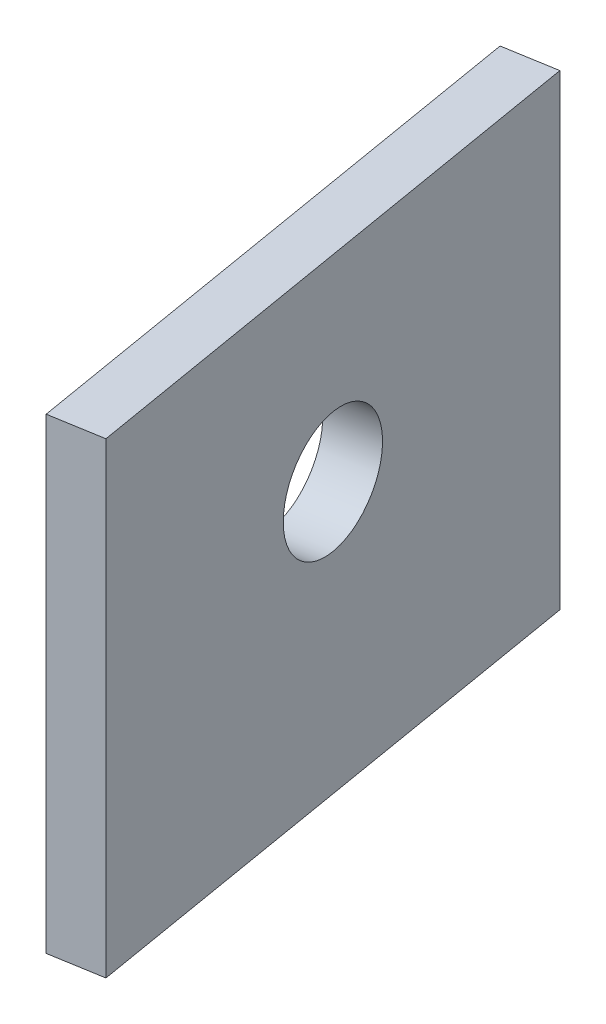
ISO-10303-21;
HEADER;
FILE_DESCRIPTION(('STEP AP214'),'2;1');
FILE_NAME('part.step','',(''),(''),'','','');
FILE_SCHEMA(('AUTOMOTIVE_DESIGN { 1 0 10303 214 1 1 1 1 }'));
ENDSEC;
DATA;
#1=APPLICATION_CONTEXT('core data for automotive mechanical design processes');
#2=APPLICATION_PROTOCOL_DEFINITION('international standard','automotive_design',2000,#1);
#3=PRODUCT_CONTEXT('',#1,'mechanical');
#4=PRODUCT('Part','Part','',(#3));
#5=PRODUCT_RELATED_PRODUCT_CATEGORY('part','',(#4));
#6=PRODUCT_DEFINITION_FORMATION('','',#4);
#7=PRODUCT_DEFINITION_CONTEXT('part definition',#1,'design');
#8=PRODUCT_DEFINITION('design','',#6,#7);
#9=PRODUCT_DEFINITION_SHAPE('','',#8);
#10=(LENGTH_UNIT() NAMED_UNIT(*) SI_UNIT(.MILLI.,.METRE.));
#11=(NAMED_UNIT(*) PLANE_ANGLE_UNIT() SI_UNIT($,.RADIAN.));
#12=(NAMED_UNIT(*) SI_UNIT($,.STERADIAN.) SOLID_ANGLE_UNIT());
#13=UNCERTAINTY_MEASURE_WITH_UNIT(LENGTH_MEASURE(1.E-05),#10,'distance_accuracy_value','');
#14=(GEOMETRIC_REPRESENTATION_CONTEXT(3) GLOBAL_UNCERTAINTY_ASSIGNED_CONTEXT((#13)) GLOBAL_UNIT_ASSIGNED_CONTEXT((#10,
#11,#12)) REPRESENTATION_CONTEXT('',''));
#15=CARTESIAN_POINT('',(0.,0.,0.));
#16=DIRECTION('',(0.,0.,1.));
#17=DIRECTION('',(1.,0.,0.));
#18=AXIS2_PLACEMENT_3D('',#15,#16,#17);
#19=CARTESIAN_POINT('',(32.261151761925,0.,-5.43127055012909));
#20=DIRECTION('',(0.986122887814664,0.,-0.16601701758575));
#21=DIRECTION('',(-0.16601701758575,0.,-0.986122887814664));
#22=AXIS2_PLACEMENT_3D('',#19,#20,#21);
#23=PLANE('',#22);
#24=DIRECTION('',(0.,-1.,0.));
#25=VECTOR('',#24,1.);
#26=CARTESIAN_POINT('',(63.8456457047169,22.7,182.177161585109));
#27=LINE('',#26,#25);
#28=CARTESIAN_POINT('',(63.8456457047169,22.7,182.177161585109));
#29=VERTEX_POINT('',#28);
#30=CARTESIAN_POINT('',(63.8456457047169,9.2,182.177161585109));
#31=VERTEX_POINT('',#30);
#32=EDGE_CURVE('E91',#29,#31,#27,.T.);
#33=ORIENTED_EDGE('',*,*,#32,.T.);
#34=DIRECTION('',(-0.16601701758575,0.,-0.986122887814664));
#35=VECTOR('',#34,1.);
#36=CARTESIAN_POINT('',(63.8456457047169,9.2,182.177161585109));
#37=LINE('',#36,#35);
#38=CARTESIAN_POINT('',(61.1893734233449,9.2,166.399195380075));
#39=VERTEX_POINT('',#38);
#40=EDGE_CURVE('E86',#31,#39,#37,.T.);
#41=ORIENTED_EDGE('',*,*,#40,.T.);
#42=DIRECTION('',(0.,1.,0.));
#43=VECTOR('',#42,1.);
#44=CARTESIAN_POINT('',(61.1893734233449,22.7,166.399195380075));
#45=LINE('',#44,#43);
#46=CARTESIAN_POINT('',(61.1893734233449,22.7,166.399195380075));
#47=VERTEX_POINT('',#46);
#48=EDGE_CURVE('E89',#39,#47,#45,.T.);
#49=ORIENTED_EDGE('',*,*,#48,.T.);
#50=DIRECTION('',(0.16601701758575,0.,0.986122887814664));
#51=VECTOR('',#50,1.);
#52=CARTESIAN_POINT('',(63.8456457047169,22.7,182.177161585109));
#53=LINE('',#52,#51);
#54=EDGE_CURVE('E56',#47,#29,#53,.T.);
#55=ORIENTED_EDGE('',*,*,#54,.T.);
#56=EDGE_LOOP('',(#33,#41,#49,#55));
#57=FACE_BOUND('',#56,.T.);
#58=CARTESIAN_POINT('',(62.5175095640309,17.0177616333024,174.288178482592));
#59=DIRECTION('',(0.986122887814664,0.,-0.166017017585749));
#60=DIRECTION('',(-0.166017017585749,0.,-0.986122887814664));
#61=AXIS2_PLACEMENT_3D('',#58,#59,#60);
#62=CIRCLE('',#61,1.75000000000002);
#63=CARTESIAN_POINT('',(62.808039344806,17.0177616333024,176.013893536268));
#64=VERTEX_POINT('',#63);
#65=EDGE_CURVE('E106',#64,#64,#62,.T.);
#66=ORIENTED_EDGE('',*,*,#65,.F.);
#67=EDGE_LOOP('',(#66));
#68=FACE_BOUND('',#67,.T.);
#69=ADVANCED_FACE('F39',(#57,#68),#23,.T.);
#70=CARTESIAN_POINT('',(30.781967430203,0.,-5.18224502375046));
#71=DIRECTION('',(0.986122887814664,0.,-0.16601701758575));
#72=DIRECTION('',(-0.16601701758575,0.,-0.986122887814664));
#73=AXIS2_PLACEMENT_3D('',#70,#71,#72);
#74=PLANE('',#73);
#75=DIRECTION('',(0.,-1.,0.));
#76=VECTOR('',#75,1.);
#77=CARTESIAN_POINT('',(62.3664613729949,22.7,182.426187111488));
#78=LINE('',#77,#76);
#79=CARTESIAN_POINT('',(62.3664613729949,22.7,182.426187111488));
#80=VERTEX_POINT('',#79);
#81=CARTESIAN_POINT('',(62.3664613729949,9.2,182.426187111488));
#82=VERTEX_POINT('',#81);
#83=EDGE_CURVE('E103',#80,#82,#78,.T.);
#84=ORIENTED_EDGE('',*,*,#83,.F.);
#85=DIRECTION('',(0.16601701758575,0.,0.986122887814664));
#86=VECTOR('',#85,1.);
#87=CARTESIAN_POINT('',(62.3664613729949,22.7,182.426187111488));
#88=LINE('',#87,#86);
#89=CARTESIAN_POINT('',(59.7101890916229,22.7,166.648220906453));
#90=VERTEX_POINT('',#89);
#91=EDGE_CURVE('E79',#90,#80,#88,.T.);
#92=ORIENTED_EDGE('',*,*,#91,.F.);
#93=DIRECTION('',(0.,1.,0.));
#94=VECTOR('',#93,1.);
#95=CARTESIAN_POINT('',(59.7101890916229,22.7,166.648220906453));
#96=LINE('',#95,#94);
#97=CARTESIAN_POINT('',(59.7101890916229,9.2,166.648220906453));
#98=VERTEX_POINT('',#97);
#99=EDGE_CURVE('E73',#98,#90,#96,.T.);
#100=ORIENTED_EDGE('',*,*,#99,.F.);
#101=DIRECTION('',(-0.16601701758575,0.,-0.986122887814664));
#102=VECTOR('',#101,1.);
#103=CARTESIAN_POINT('',(62.3664613729949,9.2,182.426187111488));
#104=LINE('',#103,#102);
#105=EDGE_CURVE('E95',#82,#98,#104,.T.);
#106=ORIENTED_EDGE('',*,*,#105,.F.);
#107=EDGE_LOOP('',(#84,#92,#100,#106));
#108=FACE_BOUND('',#107,.T.);
#109=CARTESIAN_POINT('',(61.0383252323089,17.0177616333024,174.53720400897));
#110=DIRECTION('',(0.986122887814664,0.,-0.166017017585749));
#111=DIRECTION('',(-0.166017017585749,0.,-0.986122887814664));
#112=AXIS2_PLACEMENT_3D('',#109,#110,#111);
#113=CIRCLE('',#112,1.75000000000002);
#114=CARTESIAN_POINT('',(61.328855013084,17.0177616333024,176.262919062646));
#115=VERTEX_POINT('',#114);
#116=EDGE_CURVE('E118',#115,#115,#113,.T.);
#117=ORIENTED_EDGE('',*,*,#116,.T.);
#118=EDGE_LOOP('',(#117));
#119=FACE_BOUND('',#118,.T.);
#120=ADVANCED_FACE('F114',(#108,#119),#74,.F.);
#121=CARTESIAN_POINT('',(63.8456457047169,22.7,182.177161585109));
#122=DIRECTION('',(-0.166017017585749,0.,-0.986122887814664));
#123=DIRECTION('',(-0.986122887814664,0.,0.166017017585749));
#124=AXIS2_PLACEMENT_3D('',#121,#122,#123);
#125=PLANE('',#124);
#126=ORIENTED_EDGE('',*,*,#83,.T.);
#127=DIRECTION('',(-0.986122887814664,0.,0.166017017585749));
#128=VECTOR('',#127,1.);
#129=CARTESIAN_POINT('',(63.8456457047169,9.2,182.177161585109));
#130=LINE('',#129,#128);
#131=EDGE_CURVE('E11',#31,#82,#130,.T.);
#132=ORIENTED_EDGE('',*,*,#131,.F.);
#133=ORIENTED_EDGE('',*,*,#32,.F.);
#134=DIRECTION('',(-0.986122887814664,0.,0.166017017585749));
#135=VECTOR('',#134,1.);
#136=CARTESIAN_POINT('',(63.8456457047169,22.7,182.177161585109));
#137=LINE('',#136,#135);
#138=EDGE_CURVE('E99',#29,#80,#137,.T.);
#139=ORIENTED_EDGE('',*,*,#138,.T.);
#140=EDGE_LOOP('',(#126,#132,#133,#139));
#141=FACE_BOUND('',#140,.T.);
#142=ADVANCED_FACE('F41',(#141),#125,.F.);
#143=CARTESIAN_POINT('',(63.8456457047169,9.2,182.177161585109));
#144=DIRECTION('',(0.,1.,0.));
#145=DIRECTION('',(-1.,0.,0.));
#146=AXIS2_PLACEMENT_3D('',#143,#144,#145);
#147=PLANE('',#146);
#148=ORIENTED_EDGE('',*,*,#105,.T.);
#149=DIRECTION('',(-0.986122887814664,0.,0.166017017585749));
#150=VECTOR('',#149,1.);
#151=CARTESIAN_POINT('',(61.1893734233449,9.2,166.399195380075));
#152=LINE('',#151,#150);
#153=EDGE_CURVE('E48',#39,#98,#152,.T.);
#154=ORIENTED_EDGE('',*,*,#153,.F.);
#155=ORIENTED_EDGE('',*,*,#40,.F.);
#156=ORIENTED_EDGE('',*,*,#131,.T.);
#157=EDGE_LOOP('',(#148,#154,#155,#156));
#158=FACE_BOUND('',#157,.T.);
#159=ADVANCED_FACE('F94',(#158),#147,.F.);
#160=CARTESIAN_POINT('',(61.1893734233449,22.7,166.399195380075));
#161=DIRECTION('',(0.166017017585749,0.,0.986122887814664));
#162=DIRECTION('',(0.986122887814664,0.,-0.166017017585749));
#163=AXIS2_PLACEMENT_3D('',#160,#161,#162);
#164=PLANE('',#163);
#165=ORIENTED_EDGE('',*,*,#99,.T.);
#166=DIRECTION('',(-0.986122887814664,0.,0.166017017585749));
#167=VECTOR('',#166,1.);
#168=CARTESIAN_POINT('',(61.1893734233449,22.7,166.399195380075));
#169=LINE('',#168,#167);
#170=EDGE_CURVE('E96',#47,#90,#169,.T.);
#171=ORIENTED_EDGE('',*,*,#170,.F.);
#172=ORIENTED_EDGE('',*,*,#48,.F.);
#173=ORIENTED_EDGE('',*,*,#153,.T.);
#174=EDGE_LOOP('',(#165,#171,#172,#173));
#175=FACE_BOUND('',#174,.T.);
#176=ADVANCED_FACE('F97',(#175),#164,.F.);
#177=CARTESIAN_POINT('',(63.8456457047169,22.7,182.177161585109));
#178=DIRECTION('',(0.,-1.,0.));
#179=DIRECTION('',(1.,0.,0.));
#180=AXIS2_PLACEMENT_3D('',#177,#178,#179);
#181=PLANE('',#180);
#182=ORIENTED_EDGE('',*,*,#91,.T.);
#183=ORIENTED_EDGE('',*,*,#138,.F.);
#184=ORIENTED_EDGE('',*,*,#54,.F.);
#185=ORIENTED_EDGE('',*,*,#170,.T.);
#186=EDGE_LOOP('',(#182,#183,#184,#185));
#187=FACE_BOUND('',#186,.T.);
#188=ADVANCED_FACE('F111',(#187),#181,.F.);
#189=CARTESIAN_POINT('',(62.5175095640309,17.0177616333024,174.288178482592));
#190=DIRECTION('',(-0.986122887814664,0.,0.166017017585749));
#191=DIRECTION('',(0.166017017585749,0.,0.986122887814664));
#192=AXIS2_PLACEMENT_3D('',#189,#190,#191);
#193=CYLINDRICAL_SURFACE('',#192,1.75000000000002);
#194=CARTESIAN_POINT('',(62.808039344806,17.0177616333024,176.013893536268));
#195=CARTESIAN_POINT('',(62.7926311746839,17.0177616333024,176.016487552167));
#196=CARTESIAN_POINT('',(62.7772230045618,17.0177616333024,176.019081568067));
#197=CARTESIAN_POINT('',(62.7464066643176,17.0177616333024,176.024269599867));
#198=CARTESIAN_POINT('',(62.7309984941955,17.0177616333024,176.026863615766));
#199=CARTESIAN_POINT('',(62.7001821539512,17.0177616333024,176.032051647566));
#200=CARTESIAN_POINT('',(62.6847739838291,17.0177616333024,176.034645663466));
#201=CARTESIAN_POINT('',(62.6539576435849,17.0177616333024,176.039833695265));
#202=CARTESIAN_POINT('',(62.6385494734628,17.0177616333024,176.042427711165));
#203=CARTESIAN_POINT('',(62.6077331332186,17.0177616333024,176.047615742965));
#204=CARTESIAN_POINT('',(62.5923249630965,17.0177616333024,176.050209758864));
#205=CARTESIAN_POINT('',(62.5615086228523,17.0177616333024,176.055397790664));
#206=CARTESIAN_POINT('',(62.5461004527302,17.0177616333024,176.057991806564));
#207=CARTESIAN_POINT('',(62.515284112486,17.0177616333024,176.063179838363));
#208=CARTESIAN_POINT('',(62.4998759423639,17.0177616333024,176.065773854263));
#209=CARTESIAN_POINT('',(62.4690596021197,17.0177616333024,176.070961886063));
#210=CARTESIAN_POINT('',(62.4536514319976,17.0177616333024,176.073555901962));
#211=CARTESIAN_POINT('',(62.4228350917534,17.0177616333024,176.078743933762));
#212=CARTESIAN_POINT('',(62.4074269216313,17.0177616333024,176.081337949662));
#213=CARTESIAN_POINT('',(62.3766105813871,17.0177616333024,176.086525981461));
#214=CARTESIAN_POINT('',(62.361202411265,17.0177616333024,176.089119997361));
#215=CARTESIAN_POINT('',(62.3303860710208,17.0177616333024,176.094308029161));
#216=CARTESIAN_POINT('',(62.3149779008986,17.0177616333024,176.09690204506));
#217=CARTESIAN_POINT('',(62.2841615606544,17.0177616333024,176.10209007686));
#218=CARTESIAN_POINT('',(62.2687533905323,17.0177616333024,176.10468409276));
#219=CARTESIAN_POINT('',(62.2379370502881,17.0177616333024,176.109872124559));
#220=CARTESIAN_POINT('',(62.222528880166,17.0177616333024,176.112466140459));
#221=CARTESIAN_POINT('',(62.1917125399218,17.0177616333024,176.117654172259));
#222=CARTESIAN_POINT('',(62.1763043697997,17.0177616333024,176.120248188158));
#223=CARTESIAN_POINT('',(62.1454880295555,17.0177616333024,176.125436219958));
#224=CARTESIAN_POINT('',(62.1300798594334,17.0177616333024,176.128030235858));
#225=CARTESIAN_POINT('',(62.0992635191892,17.0177616333024,176.133218267657));
#226=CARTESIAN_POINT('',(62.0838553490671,17.0177616333024,176.135812283557));
#227=CARTESIAN_POINT('',(62.0530390088229,17.0177616333024,176.141000315357));
#228=CARTESIAN_POINT('',(62.0376308387008,17.0177616333024,176.143594331256));
#229=CARTESIAN_POINT('',(62.0068144984566,17.0177616333024,176.148782363056));
#230=CARTESIAN_POINT('',(61.9914063283345,17.0177616333024,176.151376378956));
#231=CARTESIAN_POINT('',(61.9605899880902,17.0177616333024,176.156564410755));
#232=CARTESIAN_POINT('',(61.9451818179682,17.0177616333024,176.159158426655));
#233=CARTESIAN_POINT('',(61.9143654777239,17.0177616333024,176.164346458455));
#234=CARTESIAN_POINT('',(61.8989573076018,17.0177616333024,176.166940474354));
#235=CARTESIAN_POINT('',(61.8681409673576,17.0177616333024,176.172128506154));
#236=CARTESIAN_POINT('',(61.8527327972355,17.0177616333024,176.174722522054));
#237=CARTESIAN_POINT('',(61.8219164569913,17.0177616333024,176.179910553853));
#238=CARTESIAN_POINT('',(61.8065082868692,17.0177616333024,176.182504569753));
#239=CARTESIAN_POINT('',(61.775691946625,17.0177616333024,176.187692601553));
#240=CARTESIAN_POINT('',(61.7602837765029,17.0177616333024,176.190286617452));
#241=CARTESIAN_POINT('',(61.7294674362587,17.0177616333024,176.195474649252));
#242=CARTESIAN_POINT('',(61.7140592661366,17.0177616333024,176.198068665152));
#243=CARTESIAN_POINT('',(61.6832429258924,17.0177616333024,176.203256696951));
#244=CARTESIAN_POINT('',(61.6678347557703,17.0177616333024,176.205850712851));
#245=CARTESIAN_POINT('',(61.6370184155261,17.0177616333024,176.211038744651));
#246=CARTESIAN_POINT('',(61.621610245404,17.0177616333024,176.21363276055));
#247=CARTESIAN_POINT('',(61.5907939051598,17.0177616333024,176.21882079235));
#248=CARTESIAN_POINT('',(61.5753857350377,17.0177616333024,176.22141480825));
#249=CARTESIAN_POINT('',(61.5445693947934,17.0177616333024,176.226602840049));
#250=CARTESIAN_POINT('',(61.5291612246713,17.0177616333024,176.229196855949));
#251=CARTESIAN_POINT('',(61.4983448844271,17.0177616333024,176.234384887749));
#252=CARTESIAN_POINT('',(61.482936714305,17.0177616333024,176.236978903648));
#253=CARTESIAN_POINT('',(61.4521203740608,17.0177616333024,176.242166935448));
#254=CARTESIAN_POINT('',(61.4367122039387,17.0177616333024,176.244760951348));
#255=CARTESIAN_POINT('',(61.4058958636945,17.0177616333024,176.249948983147));
#256=CARTESIAN_POINT('',(61.3904876935724,17.0177616333024,176.252542999047));
#257=CARTESIAN_POINT('',(61.3596713533282,17.0177616333024,176.257731030847));
#258=CARTESIAN_POINT('',(61.3442631832061,17.0177616333024,176.260325046746));
#259=CARTESIAN_POINT('',(61.328855013084,17.0177616333024,176.262919062646));
#260=B_SPLINE_CURVE_WITH_KNOTS('',3,(#194,#195,#196,#197,#198,#199,#200,#201,#202,#203,#204,
#205,#206,#207,#208,#209,#210,#211,#212,#213,#214,#215,#216,#217,#218,#219,#220,#221,#222,#223,
#224,#225,#226,#227,#228,#229,#230,#231,#232,#233,#234,#235,#236,#237,#238,#239,#240,#241,#242,
#243,#244,#245,#246,#247,#248,#249,#250,#251,#252,#253,#254,#255,#256,#257,#258,#259),
.UNSPECIFIED.,.F.,.F.,(4,2,2,2,2,2,2,2,2,2,2,2,2,2,2,2,2,2,2,2,2,2,2,2,2,2,2,2,2,2,2,2,4),(0.,
0.0468749999999894,0.0937499999999925,0.140624999999996,0.18749999999999,0.234374999999993,
0.281249999999996,0.328124999999992,0.374999999999988,0.421874999999992,0.468749999999988,
0.515624999999991,0.562499999999992,0.609374999999988,0.656249999999991,0.703124999999987,
0.74999999999999,0.796874999999987,0.84374999999999,0.890624999999986,0.937499999999987,
0.98437499999999,1.03124999999999,1.07812499999999,1.12499999999999,1.17187499999999,
1.21874999999999,1.26562499999998,1.31249999999999,1.35937499999999,1.40624999999999,
1.45312499999999,1.49999999999998),.UNSPECIFIED.);
#261=EDGE_CURVE('BSEAM124',#64,#115,#260,.T.);
#262=ORIENTED_EDGE('',*,*,#65,.T.);
#263=ORIENTED_EDGE('',*,*,#116,.F.);
#264=ORIENTED_EDGE('',*,*,#261,.T.);
#265=ORIENTED_EDGE('',*,*,#261,.F.);
#266=EDGE_LOOP('',(#262,#264,#263,#265));
#267=FACE_BOUND('',#266,.T.);
#268=ADVANCED_FACE('F124',(#267),#193,.F.);
#269=CLOSED_SHELL('',(#69,#120,#142,#159,#176,#188,#268));
#270=MANIFOLD_SOLID_BREP('B2',#269);
#271=ADVANCED_BREP_SHAPE_REPRESENTATION('',(#18,#270),#14);
#272=SHAPE_DEFINITION_REPRESENTATION(#9,#271);
ENDSEC;
END-ISO-10303-21;
